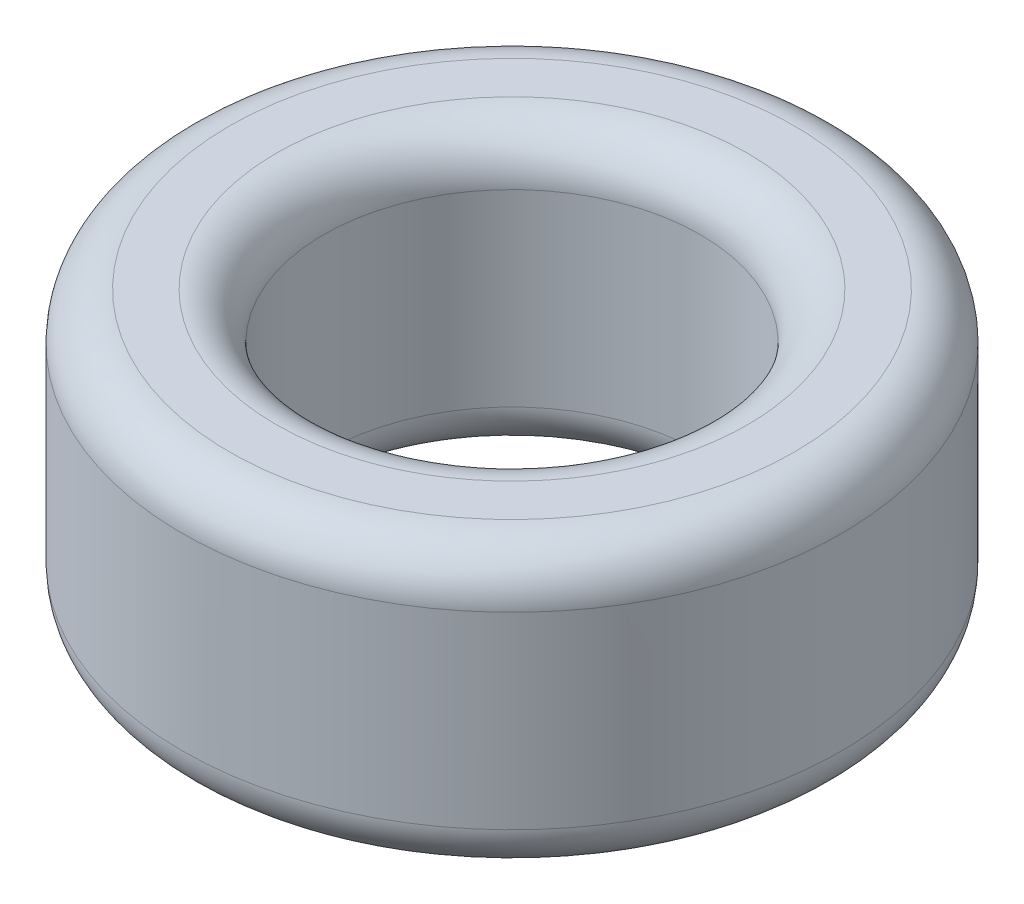
ISO-10303-21;
HEADER;
FILE_DESCRIPTION(('STEP AP214'),'2;1');
FILE_NAME('part.step','',(''),(''),'','','');
FILE_SCHEMA(('AUTOMOTIVE_DESIGN { 1 0 10303 214 1 1 1 1 }'));
ENDSEC;
DATA;
#1=APPLICATION_CONTEXT('core data for automotive mechanical design processes');
#2=APPLICATION_PROTOCOL_DEFINITION('international standard','automotive_design',2000,#1);
#3=PRODUCT_CONTEXT('',#1,'mechanical');
#4=PRODUCT('Part','Part','',(#3));
#5=PRODUCT_RELATED_PRODUCT_CATEGORY('part','',(#4));
#6=PRODUCT_DEFINITION_FORMATION('','',#4);
#7=PRODUCT_DEFINITION_CONTEXT('part definition',#1,'design');
#8=PRODUCT_DEFINITION('design','',#6,#7);
#9=PRODUCT_DEFINITION_SHAPE('','',#8);
#10=(LENGTH_UNIT() NAMED_UNIT(*) SI_UNIT(.MILLI.,.METRE.));
#11=(NAMED_UNIT(*) PLANE_ANGLE_UNIT() SI_UNIT($,.RADIAN.));
#12=(NAMED_UNIT(*) SI_UNIT($,.STERADIAN.) SOLID_ANGLE_UNIT());
#13=UNCERTAINTY_MEASURE_WITH_UNIT(LENGTH_MEASURE(1.E-05),#10,'distance_accuracy_value','');
#14=(GEOMETRIC_REPRESENTATION_CONTEXT(3) GLOBAL_UNCERTAINTY_ASSIGNED_CONTEXT((#13)) GLOBAL_UNIT_ASSIGNED_CONTEXT((#10,
#11,#12)) REPRESENTATION_CONTEXT('',''));
#15=CARTESIAN_POINT('',(0.,0.,0.));
#16=DIRECTION('',(0.,0.,1.));
#17=DIRECTION('',(1.,0.,0.));
#18=AXIS2_PLACEMENT_3D('',#15,#16,#17);
#19=CARTESIAN_POINT('',(0.,9.,0.));
#20=DIRECTION('',(0.,-1.,0.));
#21=DIRECTION('',(0.,0.,-1.));
#22=AXIS2_PLACEMENT_3D('',#19,#20,#21);
#23=CYLINDRICAL_SURFACE('',#22,4.);
#24=CARTESIAN_POINT('',(0.,4.,0.));
#25=DIRECTION('',(0.,1.,0.));
#26=DIRECTION('',(0.,0.,1.));
#27=AXIS2_PLACEMENT_3D('',#24,#25,#26);
#28=CIRCLE('',#27,4.);
#29=CARTESIAN_POINT('',(0.,4.,4.));
#30=VERTEX_POINT('',#29);
#31=EDGE_CURVE('E38',#30,#30,#28,.T.);
#32=ORIENTED_EDGE('',*,*,#31,.F.);
#33=EDGE_LOOP('',(#32));
#34=FACE_BOUND('',#33,.T.);
#35=CARTESIAN_POINT('',(0.,8.,0.));
#36=DIRECTION('',(0.,-1.,0.));
#37=DIRECTION('',(0.,0.,-1.));
#38=AXIS2_PLACEMENT_3D('',#35,#36,#37);
#39=CIRCLE('',#38,4.);
#40=CARTESIAN_POINT('',(0.,8.,-4.));
#41=VERTEX_POINT('',#40);
#42=EDGE_CURVE('E98',#41,#41,#39,.T.);
#43=ORIENTED_EDGE('',*,*,#42,.F.);
#44=EDGE_LOOP('',(#43));
#45=FACE_BOUND('',#44,.T.);
#46=ADVANCED_FACE('F17',(#34,#45),#23,.F.);
#47=CARTESIAN_POINT('',(0.,8.,0.));
#48=DIRECTION('',(0.,1.,0.));
#49=DIRECTION('',(0.,0.,1.));
#50=AXIS2_PLACEMENT_3D('',#47,#48,#49);
#51=TOROIDAL_SURFACE('',#50,5.,1.);
#52=ORIENTED_EDGE('',*,*,#42,.T.);
#53=EDGE_LOOP('',(#52));
#54=FACE_BOUND('',#53,.T.);
#55=CARTESIAN_POINT('',(0.,9.,-5.));
#56=CARTESIAN_POINT('',(0.954226153893813,9.,-4.99960198043014));
#57=CARTESIAN_POINT('',(1.840473547809,9.,-4.648941505312));
#58=CARTESIAN_POINT('',(2.31088721258162,9.,-4.46281347794201));
#59=CARTESIAN_POINT('',(2.7360487669256,9.,-4.1849775560934));
#60=CARTESIAN_POINT('',(3.16859811268564,9.,-3.90231383686393));
#61=CARTESIAN_POINT('',(3.535533905933,9.,-3.53553390593267));
#62=CARTESIAN_POINT('',(3.9009750334851,9.,-3.1702480058116));
#63=CARTESIAN_POINT('',(4.18497755609333,9.,-2.73604876692533));
#64=CARTESIAN_POINT('',(4.46185044407114,9.,-2.31274971970511));
#65=CARTESIAN_POINT('',(4.64894150531218,9.,-1.84047354780952));
#66=CARTESIAN_POINT('',(4.99980074028311,9.,-0.954795443964655));
#67=CARTESIAN_POINT('',(5.,9.,0.));
#68=CARTESIAN_POINT('',(5.00019882610757,9.,0.952717712373978));
#69=CARTESIAN_POINT('',(4.648941505312,9.,1.84047354780978));
#70=CARTESIAN_POINT('',(4.46281347475661,9.,2.31088721745081));
#71=CARTESIAN_POINT('',(4.184977556093,9.,2.7360487669254));
#72=CARTESIAN_POINT('',(3.90231383687026,9.,3.1685981126797));
#73=CARTESIAN_POINT('',(3.53553390593267,9.,3.53553390593233));
#74=CARTESIAN_POINT('',(3.17024800580662,9.,3.90097503348836));
#75=CARTESIAN_POINT('',(2.73604876692533,9.,4.18497755609333));
#76=CARTESIAN_POINT('',(2.31274978951356,9.,4.46185039841059));
#77=CARTESIAN_POINT('',(1.84047354780912,9.,4.64894150531182));
#78=CARTESIAN_POINT('',(0.955298112883083,9.,4.99960164295585));
#79=CARTESIAN_POINT('',(0.,9.,5.));
#80=B_SPLINE_CURVE_WITH_KNOTS('',2,(#55,#56,#57,#58,#59,#60,#61,#62,#63,#64,#65,#66,#67,#68,#69,
#70,#71,#72,#73,#74,#75,#76,#77,#78,#79),.UNSPECIFIED.,.F.,.F.,(3,2,2,2,2,2,2,2,2,2,2,2,3),(0.,
0.125,0.1875,0.25,0.3125,0.375,0.5,0.625,0.6875,0.75,0.8125,0.875,1.),.UNSPECIFIED.);
#81=CARTESIAN_POINT('',(0.,9.,-5.));
#82=VERTEX_POINT('',#81);
#83=CARTESIAN_POINT('',(0.,9.,5.));
#84=VERTEX_POINT('',#83);
#85=EDGE_CURVE('E33',#82,#84,#80,.T.);
#86=ORIENTED_EDGE('',*,*,#85,.F.);
#87=CARTESIAN_POINT('',(0.,9.,5.));
#88=CARTESIAN_POINT('',(-0.95422615389214,9.,4.99960198043014));
#89=CARTESIAN_POINT('',(-1.84047354780978,9.,4.64894150531211));
#90=CARTESIAN_POINT('',(-2.31088721257636,9.,4.46281347794508));
#91=CARTESIAN_POINT('',(-2.7360487669254,9.,4.1849775560936));
#92=CARTESIAN_POINT('',(-3.16859811268539,9.,3.9023138368646));
#93=CARTESIAN_POINT('',(-3.53553390593267,9.,3.535533905933));
#94=CARTESIAN_POINT('',(-3.90097503348671,9.,3.17024800580956));
#95=CARTESIAN_POINT('',(-4.18497755609333,9.,2.73604876692533));
#96=CARTESIAN_POINT('',(-4.46185044407289,9.,2.31274971970202));
#97=CARTESIAN_POINT('',(-4.64894150531218,9.,1.84047354780949));
#98=CARTESIAN_POINT('',(-4.99980074028311,9.,0.954795443962103));
#99=CARTESIAN_POINT('',(-5.,9.,0.));
#100=CARTESIAN_POINT('',(-5.00019882610757,9.,-0.952717712362112));
#101=CARTESIAN_POINT('',(-4.64894150531211,9.,-1.84047354780978));
#102=CARTESIAN_POINT('',(-4.46281347476045,9.,-2.31088721744783));
#103=CARTESIAN_POINT('',(-4.184977556093,9.,-2.736048766926));
#104=CARTESIAN_POINT('',(-3.90231383686775,9.,-3.16859811268182));
#105=CARTESIAN_POINT('',(-3.53553390593267,9.,-3.535533905933));
#106=CARTESIAN_POINT('',(-3.17024800580317,9.,-3.90097503349352));
#107=CARTESIAN_POINT('',(-2.73604876692567,9.,-4.18497755609333));
#108=CARTESIAN_POINT('',(-2.31274978950175,9.,-4.4618503984159));
#109=CARTESIAN_POINT('',(-1.84047354780906,9.,-4.64894150531182));
#110=CARTESIAN_POINT('',(-0.95529811287992,9.,-4.99960164295585));
#111=CARTESIAN_POINT('',(0.,9.,-5.));
#112=B_SPLINE_CURVE_WITH_KNOTS('',2,(#87,#88,#89,#90,#91,#92,#93,#94,#95,#96,#97,#98,#99,#100,
#101,#102,#103,#104,#105,#106,#107,#108,#109,#110,#111),.UNSPECIFIED.,.F.,.F.,(3,2,2,2,2,2,2,2,
2,2,2,2,3),(0.,0.125,0.1875,0.25,0.3125,0.375,0.5,0.625,0.6875,0.75,0.8125,0.875,1.),.UNSPECIFIED.);
#113=EDGE_CURVE('E35',#84,#82,#112,.T.);
#114=ORIENTED_EDGE('',*,*,#113,.F.);
#115=EDGE_LOOP('',(#86,#114));
#116=FACE_BOUND('',#115,.T.);
#117=ADVANCED_FACE('F36',(#54,#116),#51,.T.);
#118=CARTESIAN_POINT('',(0.,4.,0.));
#119=DIRECTION('',(0.,1.,0.));
#120=DIRECTION('',(-1.,0.,0.));
#121=AXIS2_PLACEMENT_3D('',#118,#119,#120);
#122=TOROIDAL_SURFACE('',#121,5.,1.);
#123=ORIENTED_EDGE('',*,*,#31,.T.);
#124=EDGE_LOOP('',(#123));
#125=FACE_BOUND('',#124,.T.);
#126=CARTESIAN_POINT('',(0.,3.,0.));
#127=DIRECTION('',(0.,1.,0.));
#128=DIRECTION('',(-1.,0.,0.));
#129=AXIS2_PLACEMENT_3D('',#126,#127,#128);
#130=CIRCLE('',#129,5.);
#131=CARTESIAN_POINT('',(-5.,3.,0.));
#132=VERTEX_POINT('',#131);
#133=EDGE_CURVE('E21',#132,#132,#130,.F.);
#134=ORIENTED_EDGE('',*,*,#133,.T.);
#135=EDGE_LOOP('',(#134));
#136=FACE_BOUND('',#135,.T.);
#137=ADVANCED_FACE('F59',(#125,#136),#122,.T.);
#138=CARTESIAN_POINT('',(0.,9.,0.));
#139=DIRECTION('',(0.,1.,0.));
#140=DIRECTION('',(0.,0.,1.));
#141=AXIS2_PLACEMENT_3D('',#138,#139,#140);
#142=PLANE('',#141);
#143=CARTESIAN_POINT('',(0.,9.,0.));
#144=DIRECTION('',(0.,1.,0.));
#145=DIRECTION('',(-1.,0.,0.));
#146=AXIS2_PLACEMENT_3D('',#143,#144,#145);
#147=CIRCLE('',#146,6.);
#148=CARTESIAN_POINT('',(-6.,9.,0.));
#149=VERTEX_POINT('',#148);
#150=EDGE_CURVE('E43',#149,#149,#147,.F.);
#151=ORIENTED_EDGE('',*,*,#150,.F.);
#152=EDGE_LOOP('',(#151));
#153=FACE_BOUND('',#152,.T.);
#154=ORIENTED_EDGE('',*,*,#113,.T.);
#155=ORIENTED_EDGE('',*,*,#85,.T.);
#156=EDGE_LOOP('',(#154,#155));
#157=FACE_BOUND('',#156,.T.);
#158=ADVANCED_FACE('F40',(#153,#157),#142,.T.);
#159=CARTESIAN_POINT('',(0.,3.,0.));
#160=DIRECTION('',(0.,1.,0.));
#161=DIRECTION('',(0.,0.,1.));
#162=AXIS2_PLACEMENT_3D('',#159,#160,#161);
#163=PLANE('',#162);
#164=ORIENTED_EDGE('',*,*,#133,.F.);
#165=EDGE_LOOP('',(#164));
#166=FACE_BOUND('',#165,.T.);
#167=CARTESIAN_POINT('',(0.,3.,0.));
#168=DIRECTION('',(0.,1.,0.));
#169=DIRECTION('',(0.,0.,1.));
#170=AXIS2_PLACEMENT_3D('',#167,#168,#169);
#171=CIRCLE('',#170,6.);
#172=CARTESIAN_POINT('',(0.,3.,6.));
#173=VERTEX_POINT('',#172);
#174=EDGE_CURVE('E92',#173,#173,#171,.T.);
#175=ORIENTED_EDGE('',*,*,#174,.F.);
#176=EDGE_LOOP('',(#175));
#177=FACE_BOUND('',#176,.T.);
#178=ADVANCED_FACE('F58',(#166,#177),#163,.F.);
#179=CARTESIAN_POINT('',(0.,8.,0.));
#180=DIRECTION('',(0.,1.,0.));
#181=DIRECTION('',(-1.,0.,0.));
#182=AXIS2_PLACEMENT_3D('',#179,#180,#181);
#183=TOROIDAL_SURFACE('',#182,6.,1.);
#184=ORIENTED_EDGE('',*,*,#150,.T.);
#185=EDGE_LOOP('',(#184));
#186=FACE_BOUND('',#185,.T.);
#187=CARTESIAN_POINT('',(0.,8.,0.));
#188=DIRECTION('',(0.,-1.,0.));
#189=DIRECTION('',(0.,0.,-1.));
#190=AXIS2_PLACEMENT_3D('',#187,#188,#189);
#191=CIRCLE('',#190,7.);
#192=CARTESIAN_POINT('',(0.,8.,-7.));
#193=VERTEX_POINT('',#192);
#194=EDGE_CURVE('E26',#193,#193,#191,.T.);
#195=ORIENTED_EDGE('',*,*,#194,.F.);
#196=EDGE_LOOP('',(#195));
#197=FACE_BOUND('',#196,.T.);
#198=ADVANCED_FACE('F71',(#186,#197),#183,.T.);
#199=CARTESIAN_POINT('',(0.,4.,0.));
#200=DIRECTION('',(0.,1.,0.));
#201=DIRECTION('',(0.,0.,1.));
#202=AXIS2_PLACEMENT_3D('',#199,#200,#201);
#203=TOROIDAL_SURFACE('',#202,6.,1.);
#204=CARTESIAN_POINT('',(0.,4.,0.));
#205=DIRECTION('',(0.,-1.,0.));
#206=DIRECTION('',(0.,0.,-1.));
#207=AXIS2_PLACEMENT_3D('',#204,#205,#206);
#208=CIRCLE('',#207,7.);
#209=CARTESIAN_POINT('',(0.,4.,-7.));
#210=VERTEX_POINT('',#209);
#211=EDGE_CURVE('E11',#210,#210,#208,.F.);
#212=ORIENTED_EDGE('',*,*,#211,.F.);
#213=EDGE_LOOP('',(#212));
#214=FACE_BOUND('',#213,.T.);
#215=ORIENTED_EDGE('',*,*,#174,.T.);
#216=EDGE_LOOP('',(#215));
#217=FACE_BOUND('',#216,.T.);
#218=ADVANCED_FACE('F19',(#214,#217),#203,.T.);
#219=CARTESIAN_POINT('',(0.,9.,0.));
#220=DIRECTION('',(0.,-1.,0.));
#221=DIRECTION('',(0.,0.,-1.));
#222=AXIS2_PLACEMENT_3D('',#219,#220,#221);
#223=CYLINDRICAL_SURFACE('',#222,7.);
#224=ORIENTED_EDGE('',*,*,#211,.T.);
#225=EDGE_LOOP('',(#224));
#226=FACE_BOUND('',#225,.T.);
#227=ORIENTED_EDGE('',*,*,#194,.T.);
#228=EDGE_LOOP('',(#227));
#229=FACE_BOUND('',#228,.T.);
#230=ADVANCED_FACE('F79',(#226,#229),#223,.T.);
#231=CLOSED_SHELL('',(#46,#117,#137,#158,#178,#198,#218,#230));
#232=MANIFOLD_SOLID_BREP('B1',#231);
#233=ADVANCED_BREP_SHAPE_REPRESENTATION('',(#18,#232),#14);
#234=SHAPE_DEFINITION_REPRESENTATION(#9,#233);
ENDSEC;
END-ISO-10303-21;
